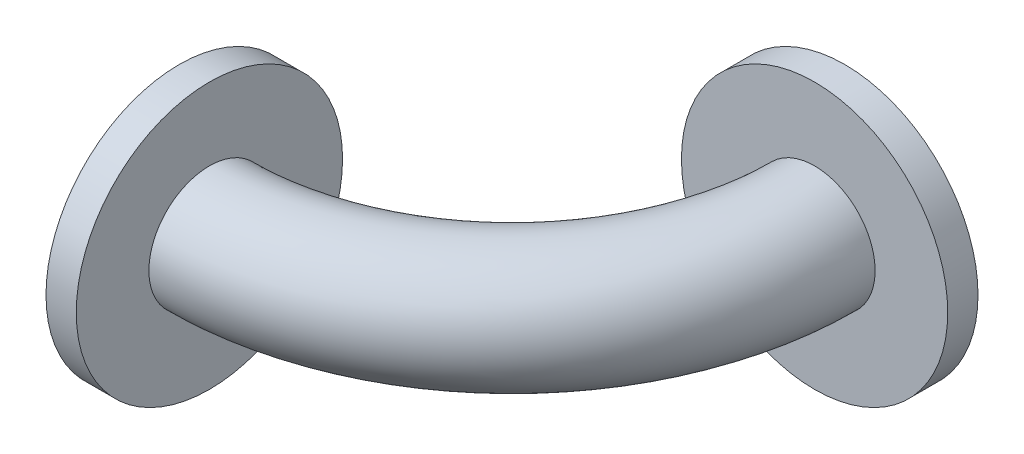
ISO-10303-21;
HEADER;
FILE_DESCRIPTION(('STEP AP214'),'2;1');
FILE_NAME('part.step','',(''),(''),'','','');
FILE_SCHEMA(('AUTOMOTIVE_DESIGN { 1 0 10303 214 1 1 1 1 }'));
ENDSEC;
DATA;
#1=APPLICATION_CONTEXT('core data for automotive mechanical design processes');
#2=APPLICATION_PROTOCOL_DEFINITION('international standard','automotive_design',2000,#1);
#3=PRODUCT_CONTEXT('',#1,'mechanical');
#4=PRODUCT('Part','Part','',(#3));
#5=PRODUCT_RELATED_PRODUCT_CATEGORY('part','',(#4));
#6=PRODUCT_DEFINITION_FORMATION('','',#4);
#7=PRODUCT_DEFINITION_CONTEXT('part definition',#1,'design');
#8=PRODUCT_DEFINITION('design','',#6,#7);
#9=PRODUCT_DEFINITION_SHAPE('','',#8);
#10=(LENGTH_UNIT() NAMED_UNIT(*) SI_UNIT(.MILLI.,.METRE.));
#11=(NAMED_UNIT(*) PLANE_ANGLE_UNIT() SI_UNIT($,.RADIAN.));
#12=(NAMED_UNIT(*) SI_UNIT($,.STERADIAN.) SOLID_ANGLE_UNIT());
#13=UNCERTAINTY_MEASURE_WITH_UNIT(LENGTH_MEASURE(1.E-05),#10,'distance_accuracy_value','');
#14=(GEOMETRIC_REPRESENTATION_CONTEXT(3) GLOBAL_UNCERTAINTY_ASSIGNED_CONTEXT((#13)) GLOBAL_UNIT_ASSIGNED_CONTEXT((#10,
#11,#12)) REPRESENTATION_CONTEXT('',''));
#15=CARTESIAN_POINT('',(0.,0.,0.));
#16=DIRECTION('',(0.,0.,1.));
#17=DIRECTION('',(1.,0.,0.));
#18=AXIS2_PLACEMENT_3D('',#15,#16,#17);
#19=CARTESIAN_POINT('',(50.,0.,0.));
#20=DIRECTION('',(-2.66713917932478E-06,0.,0.999999999996443));
#21=DIRECTION('',(0.999999999996443,0.,2.66713917932478E-06));
#22=AXIS2_PLACEMENT_3D('',#19,#20,#21);
#23=PLANE('',#22);
#24=CARTESIAN_POINT('',(50.,0.,0.));
#25=DIRECTION('',(-2.66713917932478E-06,0.,0.999999999996443));
#26=DIRECTION('',(0.999999999996443,0.,2.66713917932478E-06));
#27=AXIS2_PLACEMENT_3D('',#24,#25,#26);
#28=CIRCLE('',#27,10.);
#29=CARTESIAN_POINT('',(49.9999999993303,-10.,0.));
#30=VERTEX_POINT('',#29);
#31=CARTESIAN_POINT('',(49.9999999993303,10.,0.));
#32=VERTEX_POINT('',#31);
#33=EDGE_CURVE('E93',#30,#32,#28,.T.);
#34=ORIENTED_EDGE('',*,*,#33,.F.);
#35=DIRECTION('',(0.,1.,0.));
#36=VECTOR('',#35,1.);
#37=CARTESIAN_POINT('',(49.9999999993303,0.,0.));
#38=LINE('',#37,#36);
#39=EDGE_CURVE('E123',#30,#32,#38,.T.);
#40=ORIENTED_EDGE('',*,*,#39,.T.);
#41=EDGE_LOOP('',(#34,#40));
#42=FACE_BOUND('',#41,.T.);
#43=ADVANCED_FACE('F57',(#42),#23,.F.);
#44=CARTESIAN_POINT('',(0.,0.,50.));
#45=DIRECTION('',(-0.999999999996443,0.,2.66713917931204E-06));
#46=DIRECTION('',(2.66713917931204E-06,0.,0.999999999996443));
#47=AXIS2_PLACEMENT_3D('',#44,#45,#46);
#48=PLANE('',#47);
#49=DIRECTION('',(0.,1.,0.));
#50=VECTOR('',#49,1.);
#51=CARTESIAN_POINT('',(0.,0.,50.0000000010898));
#52=LINE('',#51,#50);
#53=CARTESIAN_POINT('',(0.,-10.,50.0000000010898));
#54=VERTEX_POINT('',#53);
#55=CARTESIAN_POINT('',(0.,10.,50.0000000010898));
#56=VERTEX_POINT('',#55);
#57=EDGE_CURVE('E95',#54,#56,#52,.T.);
#58=ORIENTED_EDGE('',*,*,#57,.F.);
#59=CARTESIAN_POINT('',(0.,0.,50.));
#60=DIRECTION('',(-0.999999999996443,0.,2.66713917931204E-06));
#61=DIRECTION('',(2.66713917931204E-06,0.,0.999999999996443));
#62=AXIS2_PLACEMENT_3D('',#59,#60,#61);
#63=CIRCLE('',#62,10.);
#64=EDGE_CURVE('E87',#54,#56,#63,.T.);
#65=ORIENTED_EDGE('',*,*,#64,.T.);
#66=EDGE_LOOP('',(#58,#65));
#67=FACE_BOUND('',#66,.T.);
#68=ADVANCED_FACE('F96',(#67),#48,.T.);
#69=CARTESIAN_POINT('',(-0.000133357314656413,0.,-0.000133357314642535));
#70=DIRECTION('',(0.,-1.,0.));
#71=DIRECTION('',(0.,0.,-1.));
#72=AXIS2_PLACEMENT_3D('',#69,#70,#71);
#73=TOROIDAL_SURFACE('',#72,50.0001333574925,10.);
#74=CARTESIAN_POINT('',(0.,-6.20998558255818,42.1618829388087));
#75=CARTESIAN_POINT('',(0.,-6.43020132472098,42.3363529568234));
#76=CARTESIAN_POINT('',(0.,-6.64303285438604,42.5200899047318));
#77=CARTESIAN_POINT('',(0.,-7.05254164509043,42.9048890274845));
#78=CARTESIAN_POINT('',(0.,-7.24921464100729,43.1059557480911));
#79=CARTESIAN_POINT('',(0.,-7.62512838650704,43.5241557106135));
#80=CARTESIAN_POINT('',(0.,-7.80435032983617,43.7413058509477));
#81=CARTESIAN_POINT('',(0.,-8.14385630952761,44.1899450428166));
#82=CARTESIAN_POINT('',(0.,-8.30414001069893,44.421434348032));
#83=CARTESIAN_POINT('',(0.,-8.6045491768707,44.8969819689388));
#84=CARTESIAN_POINT('',(0.,-8.74468457834601,45.1410340078995));
#85=CARTESIAN_POINT('',(0.,-9.00389737381209,45.640081098134));
#86=CARTESIAN_POINT('',(0.,-9.12297443523223,45.8950763221526));
#87=CARTESIAN_POINT('',(0.,-9.33919428057714,46.414128770026));
#88=CARTESIAN_POINT('',(0.,-9.43634245654888,46.6781837477608));
#89=CARTESIAN_POINT('',(0.,-9.6080496633999,47.2135326322725));
#90=CARTESIAN_POINT('',(0.,-9.68260917632374,47.4848263844387));
#91=CARTESIAN_POINT('',(0.,-9.80861915595535,48.0327615305167));
#92=CARTESIAN_POINT('',(0.,-9.86006696428687,48.3094035357852));
#93=CARTESIAN_POINT('',(0.,-9.93947525654056,48.8660384730009));
#94=CARTESIAN_POINT('',(0.,-9.96743571666048,49.1460314083438));
#95=CARTESIAN_POINT('',(0.,-9.99967107927889,49.7073883721859));
#96=CARTESIAN_POINT('',(0.,-10.0039450598039,49.9887524536291));
#97=CARTESIAN_POINT('',(0.,-9.98877460360229,50.5508404118287));
#98=CARTESIAN_POINT('',(0.,-9.96933017151927,50.8315642887104));
#99=CARTESIAN_POINT('',(0.,-9.90686172377564,51.390370845688));
#100=CARTESIAN_POINT('',(0.,-9.86383814598608,51.6684535747331));
#101=CARTESIAN_POINT('',(0.,-9.7545175736548,52.2200061277375));
#102=CARTESIAN_POINT('',(0.,-9.6882205786841,52.4934759516117));
#103=CARTESIAN_POINT('',(0.,-9.53282466253206,53.0338579296848));
#104=CARTESIAN_POINT('',(0.,-9.44372578748154,53.3007700971495));
#105=CARTESIAN_POINT('',(0.,-9.24335948463269,53.8261397544671));
#106=CARTESIAN_POINT('',(0.,-9.13209205685992,54.0845972443297));
#107=CARTESIAN_POINT('',(0.,-8.88817945836035,54.5912205567905));
#108=CARTESIAN_POINT('',(0.,-8.75553424679093,54.8393863597252));
#109=CARTESIAN_POINT('',(0.,-8.46980926185577,55.3236614611694));
#110=CARTESIAN_POINT('',(0.,-8.31672948849588,55.5597707596825));
#111=CARTESIAN_POINT('',(0.,-7.9912239814256,56.0182538396924));
#112=CARTESIAN_POINT('',(0.,-7.8187982826241,56.2406276459733));
#113=CARTESIAN_POINT('',(0.,-7.4558265419549,56.6700592633049));
#114=CARTESIAN_POINT('',(0.,-7.26528050010919,56.8771170743742));
#115=CARTESIAN_POINT('',(0.,-6.86742266452255,57.2744447214721));
#116=CARTESIAN_POINT('',(0.,-6.66011086451516,57.4647145512258));
#117=CARTESIAN_POINT('',(0.,-6.23019543542138,57.8271134459517));
#118=CARTESIAN_POINT('',(0.,-6.00759180631476,57.9992425108999));
#119=CARTESIAN_POINT('',(0.,-5.54867505323398,58.3241363143472));
#120=CARTESIAN_POINT('',(0.,-5.31236191477447,58.4769010323857));
#121=CARTESIAN_POINT('',(0.,-4.82770640321088,58.7619798625098));
#122=CARTESIAN_POINT('',(0.,-4.57936403010063,58.894293974585));
#123=CARTESIAN_POINT('',(0.,-4.07241569934764,59.1375308780213));
#124=CARTESIAN_POINT('',(0.,-3.8138097450499,59.2484536763539));
#125=CARTESIAN_POINT('',(0.,-3.28817271021681,59.448119410904));
#126=CARTESIAN_POINT('',(0.,-3.02114162968762,59.5368623471377));
#127=CARTESIAN_POINT('',(0.,-2.48055288362745,59.6915374168667));
#128=CARTESIAN_POINT('',(0.,-2.2069952207403,59.7574695596023));
#129=CARTESIAN_POINT('',(0.,-1.65529803595878,59.8660543543523));
#130=CARTESIAN_POINT('',(0.,-1.37715851406495,59.9087070063696));
#131=CARTESIAN_POINT('',(0.,-0.818274977432024,59.9704295892364));
#132=CARTESIAN_POINT('',(0.,-0.537530962335549,59.98949951685));
#133=CARTESIAN_POINT('',(0.,0.024565601611151,60.003921064458));
#134=CARTESIAN_POINT('',(0.,0.305918150461528,59.9992726844465));
#135=CARTESIAN_POINT('',(0.,0.867231570815276,59.9662906618213));
#136=CARTESIAN_POINT('',(0.,1.14719244213664,59.93795701611));
#137=CARTESIAN_POINT('',(0.,1.70373211600869,59.8578058933131));
#138=CARTESIAN_POINT('',(0.,1.98031091855925,59.8059884162266));
#139=CARTESIAN_POINT('',(0.,2.5281201333005,59.6792380246667));
#140=CARTESIAN_POINT('',(0.,2.7993505457205,59.6043051111842));
#141=CARTESIAN_POINT('',(0.,3.33453470658328,59.4318565742432));
#142=CARTESIAN_POINT('',(0.,3.59848845502664,59.3343409507865));
#143=CARTESIAN_POINT('',(0.,4.11724272315744,59.1174202764797));
#144=CARTESIAN_POINT('',(0.,4.37204324325751,58.9980152266166));
#145=CARTESIAN_POINT('',(0.,4.87067958827505,58.7381645949056));
#146=CARTESIAN_POINT('',(0.,5.11451541319281,58.5977190130583));
#147=CARTESIAN_POINT('',(0.,5.58948884130497,58.2967858012721));
#148=CARTESIAN_POINT('',(0.,5.82062644449935,58.1362981713331));
#149=CARTESIAN_POINT('',(0.,6.26856017936834,57.7964218342045));
#150=CARTESIAN_POINT('',(0.,6.48535631104256,57.6170331270144));
#151=CARTESIAN_POINT('',(0.,6.903065821756,57.2406299730615));
#152=CARTESIAN_POINT('',(0.,7.10397920007923,57.0436155255041));
#153=CARTESIAN_POINT('',(0.,7.48849481943474,56.6333615524536));
#154=CARTESIAN_POINT('',(0.,7.67209706046568,56.4201220269593));
#155=CARTESIAN_POINT('',(0.,8.02068511071337,55.9789338939122));
#156=CARTESIAN_POINT('',(0.,8.18567091913195,55.7509852857288));
#157=CARTESIAN_POINT('',(0.,8.49585314467223,55.2819995737506));
#158=CARTESIAN_POINT('',(0.,8.64104956179463,55.0409624699564));
#159=CARTESIAN_POINT('',(0.,8.91062072743841,54.5475134286759));
#160=CARTESIAN_POINT('',(0.,9.0349954786828,54.2951014926772));
#161=CARTESIAN_POINT('',(0.,9.26203910579651,53.7806972551123));
#162=CARTESIAN_POINT('',(0.,9.36470798167127,53.5187049535485));
#163=CARTESIAN_POINT('',(0.,9.54760993141964,52.9870026293715));
#164=CARTESIAN_POINT('',(0.,9.62784300837192,52.7172926078174));
#165=CARTESIAN_POINT('',(0.,9.76530297013513,52.1720722851394));
#166=CARTESIAN_POINT('',(0.,9.8225298549434,51.896561984015));
#167=CARTESIAN_POINT('',(0.,9.91357060214882,51.3416997020809));
#168=CARTESIAN_POINT('',(0.,9.94738445506185,51.0623477197152));
#169=CARTESIAN_POINT('',(0.,9.99135870471777,50.501788210554));
#170=CARTESIAN_POINT('',(0.,10.0015191014434,50.2205806837573));
#171=CARTESIAN_POINT('',(0.,9.99811420376144,49.6583092120281));
#172=CARTESIAN_POINT('',(0.,9.98454890162156,49.3772452671425));
#173=CARTESIAN_POINT('',(0.,9.93378903254252,48.8172592494892));
#174=CARTESIAN_POINT('',(0.,9.89659446561549,48.5383371767204));
#175=CARTESIAN_POINT('',(0.,9.79884055009292,47.984618166952));
#176=CARTESIAN_POINT('',(0.,9.73828122618488,47.709821225594));
#177=CARTESIAN_POINT('',(0.,9.5942283345416,47.1663058169045));
#178=CARTESIAN_POINT('',(0.,9.5107347668367,46.897587349565));
#179=CARTESIAN_POINT('',(0.,9.32140701160263,46.3681394129501));
#180=CARTESIAN_POINT('',(0.,9.2155728324237,46.1074099406886));
#181=CARTESIAN_POINT('',(0.,8.98231625172075,45.5957935159635));
#182=CARTESIAN_POINT('',(0.,8.85489385017054,45.3449065635117));
#183=CARTESIAN_POINT('',(0.,8.5793664711872,44.854758388752));
#184=CARTESIAN_POINT('',(0.,8.4312614564342,44.6154971874226));
#185=CARTESIAN_POINT('',(0.,8.11542196491531,44.1503020063497));
#186=CARTESIAN_POINT('',(0.,7.94768748814381,43.92436802661));
#187=CARTESIAN_POINT('',(0.,7.59378190483604,43.4874339646057));
#188=CARTESIAN_POINT('',(0.,7.40761083352429,43.2764338538102));
#189=CARTESIAN_POINT('',(0.,7.01815535528078,42.8708671359784));
#190=CARTESIAN_POINT('',(0.,6.81487094832929,42.6763005289612));
#191=CARTESIAN_POINT('',(0.,6.39263359844399,42.3049836920898));
#192=CARTESIAN_POINT('',(0.,6.17368062381195,42.1282334982807));
#193=CARTESIAN_POINT('',(0.,5.72166313589121,41.7938065303585));
#194=CARTESIAN_POINT('',(0.,5.48859862286261,41.6361297558938));
#195=CARTESIAN_POINT('',(0.,5.01001055813585,41.3409678691536));
#196=CARTESIAN_POINT('',(0.,4.76448677515396,41.2034831318913));
#197=CARTESIAN_POINT('',(0.,4.26272969886802,40.9496862605778));
#198=CARTESIAN_POINT('',(0.,4.00649640346725,40.833374130672));
#199=CARTESIAN_POINT('',(0.,3.48515224531628,40.6227535518669));
#200=CARTESIAN_POINT('',(0.,3.22004172848917,40.528444246711));
#201=CARTESIAN_POINT('',(0.,2.68281862890009,40.3624940388988));
#202=CARTESIAN_POINT('',(0.,2.41070605323433,40.2908531132704));
#203=CARTESIAN_POINT('',(0.,1.86144467386462,40.1707557510868));
#204=CARTESIAN_POINT('',(0.,1.58429645282508,40.1222966497196));
#205=CARTESIAN_POINT('',(0.,1.02689723226402,40.048894320425));
#206=CARTESIAN_POINT('',(0.,0.74664616664901,40.023951594397));
#207=CARTESIAN_POINT('',(0.,0.184969787160073,39.9977578950793));
#208=CARTESIAN_POINT('',(0.,-0.0964557988441161,39.9965127566134));
#209=CARTESIAN_POINT('',(0.,-0.658406660668894,40.0177377535432));
#210=CARTESIAN_POINT('',(0.,-0.938931950636251,40.0402075144474));
#211=CARTESIAN_POINT('',(0.,-1.49723058144236,40.1087191609368));
#212=CARTESIAN_POINT('',(0.,-1.77500249097888,40.1547727119518));
#213=CARTESIAN_POINT('',(0.,-2.32566976303352,40.2701286403147));
#214=CARTESIAN_POINT('',(0.,-2.598565211761,40.3394306062324));
#215=CARTESIAN_POINT('',(0.,-3.13726004570646,40.5007074755703));
#216=CARTESIAN_POINT('',(0.,-3.40306667782265,40.5926581568067));
#217=CARTESIAN_POINT('',(0.,-3.92590982917891,40.7985776886846));
#218=CARTESIAN_POINT('',(0.,-4.18294863694591,40.9125407412342));
#219=CARTESIAN_POINT('',(0.,-4.74924099581045,41.1927433730867));
#220=CARTESIAN_POINT('',(0.,-5.05557035306543,41.364934631929));
#221=CARTESIAN_POINT('',(0.,-5.64843390139968,41.7405605536991));
#222=CARTESIAN_POINT('',(0.,-5.93496809247894,41.9439952166268));
#223=CARTESIAN_POINT('',(0.,-6.20998558255818,42.1618829388087));
#224=B_SPLINE_CURVE_WITH_KNOTS('',3,(#74,#75,#76,#77,#78,#79,#80,#81,#82,#83,#84,#85,#86,#87,
#88,#89,#90,#91,#92,#93,#94,#95,#96,#97,#98,#99,#100,#101,#102,#103,#104,#105,#106,#107,#108,
#109,#110,#111,#112,#113,#114,#115,#116,#117,#118,#119,#120,#121,#122,#123,#124,#125,#126,#127,
#128,#129,#130,#131,#132,#133,#134,#135,#136,#137,#138,#139,#140,#141,#142,#143,#144,#145,#146,
#147,#148,#149,#150,#151,#152,#153,#154,#155,#156,#157,#158,#159,#160,#161,#162,#163,#164,#165,
#166,#167,#168,#169,#170,#171,#172,#173,#174,#175,#176,#177,#178,#179,#180,#181,#182,#183,#184,
#185,#186,#187,#188,#189,#190,#191,#192,#193,#194,#195,#196,#197,#198,#199,#200,#201,#202,#203,
#204,#205,#206,#207,#208,#209,#210,#211,#212,#213,#214,#215,#216,#217,#218,#219,#220,#221,#222,
#223),.UNSPECIFIED.,.T.,.F.,(4,2,2,2,2,2,2,2,2,2,2,2,2,2,2,2,2,2,2,2,2,2,2,2,2,2,2,2,2,2,2,2,2,
2,2,2,2,2,2,2,2,2,2,2,2,2,2,2,2,2,2,2,2,2,2,2,2,2,2,2,2,2,2,2,2,2,2,2,2,2,2,2,2,2,4),(0.,
0.842553434720956,1.68532855570639,2.52900207443473,3.37269052324004,4.2159614550393,
5.05924570327715,5.90232237172226,6.7453810475503,7.58853666965376,8.43169314621697,
9.27488244160591,10.1180715719138,10.9612450445041,11.8044185326358,12.6475903149437,
13.4907620962797,14.333935488529,15.177108880537,16.0202807510996,16.8634526206392,
17.7066248053293,18.5497969911353,19.3929700678461,20.2361431449891,21.0793159473369,
21.922488749068,22.765661209248,23.6088336693299,24.4520062451135,25.2951788211084,
26.1383515073718,26.9815241936647,27.8246968438083,28.667869493886,29.5110421059532,
30.3542147179978,31.1973873300431,32.040559942111,32.8837325921895,33.7269052423338,
34.5700779286288,35.4132506148942,36.2564231908913,37.0995957666769,37.9427682267618,
38.7859406869447,39.6291134886788,40.4722862910295,41.3154593681755,42.1586324448892,
43.0018046306982,43.8449768153913,44.6881486849326,45.531320555497,46.3744939475067,
47.2176673397578,48.0608391210929,48.9040109034001,49.7471843915309,50.5903578641204,
51.4335469944245,52.2767362898096,53.119892766369,53.9630483884687,54.8061070642906,
55.6491837327297,56.4924679809614,57.3357389127546,58.1794273615513,59.023100880271,
59.8658760012479,60.7084294359603,61.7606563503436,62.8128832647268),.UNSPECIFIED.);
#225=EDGE_CURVE('E12',#56,#54,#224,.T.);
#226=ORIENTED_EDGE('',*,*,#225,.F.);
#227=ORIENTED_EDGE('',*,*,#64,.F.);
#228=EDGE_LOOP('',(#226,#227));
#229=FACE_BOUND('',#228,.T.);
#230=CARTESIAN_POINT('',(41.9999999999675,-6.00000000000176,0.));
#231=CARTESIAN_POINT('',(41.8314264035113,-5.77523856456629,0.));
#232=CARTESIAN_POINT('',(41.6723519470669,-5.54339412673767,0.));
#233=CARTESIAN_POINT('',(41.374234007088,-5.067060726278,0.));
#234=CARTESIAN_POINT('',(41.2351958049634,-4.82256845276572,0.));
#235=CARTESIAN_POINT('',(40.9780660098721,-4.32248183908658,0.));
#236=CARTESIAN_POINT('',(40.8599969039742,-4.06687594195366,0.));
#237=CARTESIAN_POINT('',(40.6458218136703,-3.54661594405293,0.));
#238=CARTESIAN_POINT('',(40.5497162179719,-3.28196168324354,0.));
#239=CARTESIAN_POINT('',(40.3801979595513,-2.74562711701867,0.));
#240=CARTESIAN_POINT('',(40.3067740902889,-2.47395035340253,0.));
#241=CARTESIAN_POINT('',(40.1830757052579,-1.92537220843036,0.));
#242=CARTESIAN_POINT('',(40.1328015550686,-1.64847074463799,0.));
#243=CARTESIAN_POINT('',(40.0557714124722,-1.09148526700735,0.));
#244=CARTESIAN_POINT('',(40.0290096339671,-0.811402053352338,0.));
#245=CARTESIAN_POINT('',(39.9991736671565,-0.24998277321268,0.));
#246=CARTESIAN_POINT('',(39.9960989733318,0.0313532664065012,0.));
#247=CARTESIAN_POINT('',(40.0136587264254,0.593316872291762,0.));
#248=CARTESIAN_POINT('',(40.0342958997814,0.87394435336776,0.));
#249=CARTESIAN_POINT('',(40.099137150124,1.43246359426671,0.));
#250=CARTESIAN_POINT('',(40.1433412509933,1.71035535131697,0.));
#251=CARTESIAN_POINT('',(40.255004295806,2.26143803465299,0.));
#252=CARTESIAN_POINT('',(40.3224641448483,2.53462877754369,0.));
#253=CARTESIAN_POINT('',(40.4801586888924,3.07435597369518,0.));
#254=CARTESIAN_POINT('',(40.5703933794352,3.34089242825874,0.));
#255=CARTESIAN_POINT('',(40.7729941894959,3.86541124283057,0.));
#256=CARTESIAN_POINT('',(40.88535989801,4.12339376159338,0.));
#257=CARTESIAN_POINT('',(41.1314249527721,4.62897579754572,0.));
#258=CARTESIAN_POINT('',(41.2651242994134,4.87657531454388,0.));
#259=CARTESIAN_POINT('',(41.5529058127922,5.35963056348833,0.));
#260=CARTESIAN_POINT('',(41.7069879382927,5.59508632000169,0.));
#261=CARTESIAN_POINT('',(42.034439788758,6.05218064042862,0.));
#262=CARTESIAN_POINT('',(42.2078095137005,6.27381920435812,0.));
#263=CARTESIAN_POINT('',(42.5726043596335,6.70170383461561,0.));
#264=CARTESIAN_POINT('',(42.764029515119,6.90794987153473,0.));
#265=CARTESIAN_POINT('',(43.1635740217453,7.30358269135118,0.));
#266=CARTESIAN_POINT('',(43.3716933728813,7.49296947425334,0.));
#267=CARTESIAN_POINT('',(43.8031462745918,7.85353703157115,0.));
#268=CARTESIAN_POINT('',(44.0264797977128,8.02471783883762,0.));
#269=CARTESIAN_POINT('',(44.4867736131906,8.34765684533502,0.));
#270=CARTESIAN_POINT('',(44.7237339055308,8.49941504458952,0.));
#271=CARTESIAN_POINT('',(45.2095967078661,8.78242998022274,0.));
#272=CARTESIAN_POINT('',(45.4584992223248,8.91368670893849,0.));
#273=CARTESIAN_POINT('',(45.9664768413055,9.15476547964868,0.));
#274=CARTESIAN_POINT('',(46.225551945841,9.26458752161474,0.));
#275=CARTESIAN_POINT('',(46.7520331563694,9.46201625492945,0.));
#276=CARTESIAN_POINT('',(47.0194392711647,9.549622922805,0.));
#277=CARTESIAN_POINT('',(47.5606811422236,9.70199792497949,0.));
#278=CARTESIAN_POINT('',(47.8345168984903,9.76676625926672,0.));
#279=CARTESIAN_POINT('',(48.3866711521309,9.8730041123883,0.));
#280=CARTESIAN_POINT('',(48.6649896480438,9.91447363881574,0.));
#281=CARTESIAN_POINT('',(49.2241307893944,9.97381908510582,0.));
#282=CARTESIAN_POINT('',(49.5049534348301,9.99169500498572,0.));
#283=CARTESIAN_POINT('',(50.0671062798365,10.0037261486732,0.));
#284=CARTESIAN_POINT('',(50.3484364792014,9.99788138208949,0.));
#285=CARTESIAN_POINT('',(50.9096044572702,9.96251272730055,0.));
#286=CARTESIAN_POINT('',(51.1894422359742,9.93298883909806,0.));
#287=CARTESIAN_POINT('',(51.7456359327891,9.85047183246567,0.));
#288=CARTESIAN_POINT('',(52.0219918504223,9.79747871081523,0.));
#289=CARTESIAN_POINT('',(52.5692570612562,9.66839998579528,0.));
#290=CARTESIAN_POINT('',(52.8401663544556,9.59231438241998,0.));
#291=CARTESIAN_POINT('',(53.3746123488409,9.41759160549357,0.));
#292=CARTESIAN_POINT('',(53.6381490490627,9.31895442899322,0.));
#293=CARTESIAN_POINT('',(54.155976232293,9.09982976266649,0.));
#294=CARTESIAN_POINT('',(54.4102667153011,8.97934227283934,0.));
#295=CARTESIAN_POINT('',(54.907793600213,8.71737357945955,0.));
#296=CARTESIAN_POINT('',(55.1510300025908,8.57589237680699,0.));
#297=CARTESIAN_POINT('',(55.6247194726852,8.27294210059335,0.));
#298=CARTESIAN_POINT('',(55.8551725404029,8.11147302703384,0.));
#299=CARTESIAN_POINT('',(56.3016569478077,7.76969496513573,0.));
#300=CARTESIAN_POINT('',(56.5176882881449,7.58938597764645,0.));
#301=CARTESIAN_POINT('',(56.9337933988347,7.21120997069252,0.));
#302=CARTESIAN_POINT('',(57.1338671691878,7.01334295122834,0.));
#303=CARTESIAN_POINT('',(57.5166347353415,6.60145759621685,0.));
#304=CARTESIAN_POINT('',(57.6993285311422,6.38743926066959,0.));
#305=CARTESIAN_POINT('',(58.0460373048253,5.94477281555865,0.));
#306=CARTESIAN_POINT('',(58.2100522827073,5.71612470599457,0.));
#307=CARTESIAN_POINT('',(58.5182373793296,5.24582425323225,0.));
#308=CARTESIAN_POINT('',(58.6624074971754,5.00417190944777,0.));
#309=CARTESIAN_POINT('',(58.9298779017829,4.50958100112702,0.));
#310=CARTESIAN_POINT('',(59.053178188543,4.25664243658987,0.));
#311=CARTESIAN_POINT('',(59.2780323445881,3.74127731744886,0.));
#312=CARTESIAN_POINT('',(59.3795862129409,3.47885076243823,0.));
#313=CARTESIAN_POINT('',(59.560225538224,2.94637536841382,0.));
#314=CARTESIAN_POINT('',(59.6393109951551,2.6763265294003,0.));
#315=CARTESIAN_POINT('',(59.7744512384693,2.13052648879602,0.));
#316=CARTESIAN_POINT('',(59.8305060278643,1.85477528795102,0.));
#317=CARTESIAN_POINT('',(59.9191864350554,1.2995309150687,0.));
#318=CARTESIAN_POINT('',(59.9518120528575,1.02003774303232,0.));
#319=CARTESIAN_POINT('',(59.9934021654622,0.459296494961077,0.));
#320=CARTESIAN_POINT('',(60.0023666635117,0.178048419167035,0.));
#321=CARTESIAN_POINT('',(59.9965708137919,-0.384203169956186,0.));
#322=CARTESIAN_POINT('',(59.9818104660199,-0.665206683285336,0.));
#323=CARTESIAN_POINT('',(59.9286698510423,-1.22497149514938,0.));
#324=CARTESIAN_POINT('',(59.8902895742689,-1.50373279277596,0.));
#325=CARTESIAN_POINT('',(59.7901819537701,-2.05703123146743,0.));
#326=CARTESIAN_POINT('',(59.7284546100276,-2.33156837252923,0.));
#327=CARTESIAN_POINT('',(59.5820916763239,-2.8744667910957,0.));
#328=CARTESIAN_POINT('',(59.4974560788968,-3.14282806658761,0.));
#329=CARTESIAN_POINT('',(59.3058783557833,-3.6714667714489,0.));
#330=CARTESIAN_POINT('',(59.1989362301084,-3.93174420082242,0.));
#331=CARTESIAN_POINT('',(58.9635058702899,-4.4423645249864,0.));
#332=CARTESIAN_POINT('',(58.8350176589123,-4.6927074302735,0.));
#333=CARTESIAN_POINT('',(58.5574085221204,-5.18167921088862,0.));
#334=CARTESIAN_POINT('',(58.4082875967333,-5.42030808623214,0.));
#335=CARTESIAN_POINT('',(58.0904732505884,-5.88415521392271,0.));
#336=CARTESIAN_POINT('',(57.9217798371462,-6.1093734712822,0.));
#337=CARTESIAN_POINT('',(57.5660197768935,-6.54479829603743,0.));
#338=CARTESIAN_POINT('',(57.3789531300606,-6.75500486341494,0.));
#339=CARTESIAN_POINT('',(56.987776179206,-7.15891223262756,0.));
#340=CARTESIAN_POINT('',(56.7836658444308,-7.35261300467846,0.));
#341=CARTESIAN_POINT('',(56.3598529141237,-7.72213125997208,0.));
#342=CARTESIAN_POINT('',(56.1401503185873,-7.89794874320969,0.));
#343=CARTESIAN_POINT('',(55.6867152570194,-8.23045014376663,0.));
#344=CARTESIAN_POINT('',(55.4529828177932,-8.3871340976407,0.));
#345=CARTESIAN_POINT('',(54.9731493830798,-8.68025490392073,0.));
#346=CARTESIAN_POINT('',(54.7270483875782,-8.81669175630336,0.));
#347=CARTESIAN_POINT('',(54.2242269580845,-9.06834863187171,0.));
#348=CARTESIAN_POINT('',(53.9675065026092,-9.18356861213304,0.));
#349=CARTESIAN_POINT('',(53.4452717580431,-9.3919722537143,0.));
#350=CARTESIAN_POINT('',(53.1797574691145,-9.48515591544041,0.));
#351=CARTESIAN_POINT('',(52.6418177040877,-9.64882596243885,0.));
#352=CARTESIAN_POINT('',(52.3693920997404,-9.71931192619093,0.));
#353=CARTESIAN_POINT('',(51.819571248691,-9.83708309092862,0.));
#354=CARTESIAN_POINT('',(51.5421760010161,-9.88436828737194,0.));
#355=CARTESIAN_POINT('',(50.9843989774114,-9.95540033220998,0.));
#356=CARTESIAN_POINT('',(50.7040173181444,-9.97914809669857,0.));
#357=CARTESIAN_POINT('',(50.1422503808102,-10.0029396566297,0.));
#358=CARTESIAN_POINT('',(49.8608651037604,-10.002983476094,0.));
#359=CARTESIAN_POINT('',(49.2991233832588,-9.97936825384785,0.));
#360=CARTESIAN_POINT('',(49.0187668252316,-9.95571193749857,0.));
#361=CARTESIAN_POINT('',(48.4610366753523,-9.8848679331709,0.));
#362=CARTESIAN_POINT('',(48.1836631472906,-9.8376797429951,0.));
#363=CARTESIAN_POINT('',(47.6338088641995,-9.72009261558878,0.));
#364=CARTESIAN_POINT('',(47.361329330669,-9.64968796633886,0.));
#365=CARTESIAN_POINT('',(46.8232752977523,-9.48617304571087,0.));
#366=CARTESIAN_POINT('',(46.5577006893955,-9.39306313289854,0.));
#367=CARTESIAN_POINT('',(46.0352107763439,-9.18474727265052,0.));
#368=CARTESIAN_POINT('',(45.7782998241126,-9.06953040793752,0.));
#369=CARTESIAN_POINT('',(45.2751096285732,-8.81785390557428,0.));
#370=CARTESIAN_POINT('',(45.0288301972049,-8.68139464387641,0.));
#371=CARTESIAN_POINT('',(44.5489029713836,-8.38835503797543,0.));
#372=CARTESIAN_POINT('',(44.3152420052176,-8.23179627472917,0.));
#373=CARTESIAN_POINT('',(43.8620040533968,-7.89961684495312,0.));
#374=CARTESIAN_POINT('',(43.642423379214,-7.72400120335994,0.));
#375=CARTESIAN_POINT('',(43.1660676645997,-7.30892797635115,0.));
#376=CARTESIAN_POINT('',(42.913634976943,-7.06445866754354,0.));
#377=CARTESIAN_POINT('',(42.4358631184931,-6.55034187988129,0.));
#378=CARTESIAN_POINT('',(42.2105239476999,-6.28069440102664,0.));
#379=CARTESIAN_POINT('',(41.9999999999675,-6.00000000000176,0.));
#380=B_SPLINE_CURVE_WITH_KNOTS('',3,(#230,#231,#232,#233,#234,#235,#236,#237,#238,#239,#240,
#241,#242,#243,#244,#245,#246,#247,#248,#249,#250,#251,#252,#253,#254,#255,#256,#257,#258,#259,
#260,#261,#262,#263,#264,#265,#266,#267,#268,#269,#270,#271,#272,#273,#274,#275,#276,#277,#278,
#279,#280,#281,#282,#283,#284,#285,#286,#287,#288,#289,#290,#291,#292,#293,#294,#295,#296,#297,
#298,#299,#300,#301,#302,#303,#304,#305,#306,#307,#308,#309,#310,#311,#312,#313,#314,#315,#316,
#317,#318,#319,#320,#321,#322,#323,#324,#325,#326,#327,#328,#329,#330,#331,#332,#333,#334,#335,
#336,#337,#338,#339,#340,#341,#342,#343,#344,#345,#346,#347,#348,#349,#350,#351,#352,#353,#354,
#355,#356,#357,#358,#359,#360,#361,#362,#363,#364,#365,#366,#367,#368,#369,#370,#371,#372,#373,
#374,#375,#376,#377,#378,#379),.UNSPECIFIED.,.T.,.F.,(4,2,2,2,2,2,2,2,2,2,2,2,2,2,2,2,2,2,2,2,2,
2,2,2,2,2,2,2,2,2,2,2,2,2,2,2,2,2,2,2,2,2,2,2,2,2,2,2,2,2,2,2,2,2,2,2,2,2,2,2,2,2,2,2,2,2,2,2,2,
2,2,2,2,2,4),(0.,0.842553434714818,1.68532855569408,2.52900207441617,3.37269052321523,
4.21596145500851,5.0592457032404,5.90232237167955,6.74538104750164,7.58853666959507,
8.43169314614823,9.27488244152712,10.1180715718249,10.9612450444051,11.8044185325266,
12.6475903148244,13.4907620961502,14.3339354883943,15.1771088803972,16.0202807509547,
16.8634526204891,17.7066248051805,18.5497969909879,19.3929700677,20.2361431448444,
21.0793159471983,21.9224887489356,22.7656612091216,23.6088336692097,24.4520062450009,
25.2951788210036,26.1383515072746,26.9815241935752,27.8246968437251,28.6678694938093,
29.5110421058828,30.3542147179338,31.1973873299823,32.0405599420534,32.8837325921351,
33.7269052422826,34.5700779285768,35.4132506148415,36.2564231908378,37.0995957666226,
37.9427682267029,38.7859406868813,39.6291134886108,40.472286290957,41.3154593680959,
42.1586324448024,43.0018046306043,43.8449768152902,44.688148684824,45.5313205553809,
46.3744939473832,47.2176673396268,48.0608391209573,48.9040109032597,49.747184391386,
50.5903578639708,51.4335469942759,52.2767362896621,53.1198927662226,53.9630483883233,
54.8061070641527,55.6491837325992,56.4924679808385,57.3357389126391,58.1794273614466,
59.0231008801772,59.8658760011649,60.7084294358882,61.7606563503075,62.8128832647268),.UNSPECIFIED.);
#381=EDGE_CURVE('E72',#30,#32,#380,.T.);
#382=ORIENTED_EDGE('',*,*,#381,.F.);
#383=ORIENTED_EDGE('',*,*,#33,.T.);
#384=EDGE_LOOP('',(#382,#383));
#385=FACE_BOUND('',#384,.T.);
#386=ADVANCED_FACE('F89',(#229,#385),#73,.T.);
#387=CARTESIAN_POINT('',(50.,0.,0.));
#388=DIRECTION('',(0.,0.,1.));
#389=DIRECTION('',(1.,0.,0.));
#390=AXIS2_PLACEMENT_3D('',#387,#388,#389);
#391=PLANE('',#390);
#392=CARTESIAN_POINT('',(50.,0.,0.));
#393=DIRECTION('',(0.,0.,1.));
#394=DIRECTION('',(1.,0.,0.));
#395=AXIS2_PLACEMENT_3D('',#392,#393,#394);
#396=CIRCLE('',#395,22.);
#397=CARTESIAN_POINT('',(72.,0.,0.));
#398=VERTEX_POINT('',#397);
#399=EDGE_CURVE('E99',#398,#398,#396,.T.);
#400=ORIENTED_EDGE('',*,*,#399,.T.);
#401=EDGE_LOOP('',(#400));
#402=FACE_BOUND('',#401,.T.);
#403=ORIENTED_EDGE('',*,*,#39,.F.);
#404=ORIENTED_EDGE('',*,*,#381,.T.);
#405=EDGE_LOOP('',(#403,#404));
#406=FACE_BOUND('',#405,.T.);
#407=ADVANCED_FACE('F148',(#402,#406),#391,.T.);
#408=CARTESIAN_POINT('',(50.,0.,-5.));
#409=DIRECTION('',(0.,0.,1.));
#410=DIRECTION('',(1.,0.,0.));
#411=AXIS2_PLACEMENT_3D('',#408,#409,#410);
#412=CYLINDRICAL_SURFACE('',#411,22.);
#413=CARTESIAN_POINT('',(50.,0.,-5.));
#414=DIRECTION('',(0.,0.,1.));
#415=DIRECTION('',(1.,0.,0.));
#416=AXIS2_PLACEMENT_3D('',#413,#414,#415);
#417=CIRCLE('',#416,22.);
#418=CARTESIAN_POINT('',(72.,0.,-5.));
#419=VERTEX_POINT('',#418);
#420=EDGE_CURVE('E119',#419,#419,#417,.T.);
#421=ORIENTED_EDGE('',*,*,#420,.T.);
#422=EDGE_LOOP('',(#421));
#423=FACE_BOUND('',#422,.T.);
#424=ORIENTED_EDGE('',*,*,#399,.F.);
#425=EDGE_LOOP('',(#424));
#426=FACE_BOUND('',#425,.T.);
#427=ADVANCED_FACE('F153',(#423,#426),#412,.T.);
#428=CARTESIAN_POINT('',(50.,0.,-5.));
#429=DIRECTION('',(0.,0.,1.));
#430=DIRECTION('',(1.,0.,0.));
#431=AXIS2_PLACEMENT_3D('',#428,#429,#430);
#432=PLANE('',#431);
#433=ORIENTED_EDGE('',*,*,#420,.F.);
#434=EDGE_LOOP('',(#433));
#435=FACE_BOUND('',#434,.T.);
#436=ADVANCED_FACE('F156',(#435),#432,.F.);
#437=CARTESIAN_POINT('',(-5.,0.,50.));
#438=DIRECTION('',(1.,0.,0.));
#439=DIRECTION('',(0.,0.,-1.));
#440=AXIS2_PLACEMENT_3D('',#437,#438,#439);
#441=CYLINDRICAL_SURFACE('',#440,22.);
#442=CARTESIAN_POINT('',(-5.,0.,50.));
#443=DIRECTION('',(1.,0.,0.));
#444=DIRECTION('',(0.,0.,-1.));
#445=AXIS2_PLACEMENT_3D('',#442,#443,#444);
#446=CIRCLE('',#445,22.);
#447=CARTESIAN_POINT('',(-5.,0.,28.));
#448=VERTEX_POINT('',#447);
#449=EDGE_CURVE('E100',#448,#448,#446,.T.);
#450=ORIENTED_EDGE('',*,*,#449,.T.);
#451=EDGE_LOOP('',(#450));
#452=FACE_BOUND('',#451,.T.);
#453=CARTESIAN_POINT('',(0.,0.,50.));
#454=DIRECTION('',(1.,0.,0.));
#455=DIRECTION('',(0.,0.,-1.));
#456=AXIS2_PLACEMENT_3D('',#453,#454,#455);
#457=CIRCLE('',#456,22.);
#458=CARTESIAN_POINT('',(0.,0.,28.));
#459=VERTEX_POINT('',#458);
#460=EDGE_CURVE('E108',#459,#459,#457,.T.);
#461=ORIENTED_EDGE('',*,*,#460,.F.);
#462=EDGE_LOOP('',(#461));
#463=FACE_BOUND('',#462,.T.);
#464=ADVANCED_FACE('F162',(#452,#463),#441,.T.);
#465=CARTESIAN_POINT('',(-5.,0.,50.));
#466=DIRECTION('',(1.,0.,0.));
#467=DIRECTION('',(0.,0.,-1.));
#468=AXIS2_PLACEMENT_3D('',#465,#466,#467);
#469=PLANE('',#468);
#470=ORIENTED_EDGE('',*,*,#449,.F.);
#471=EDGE_LOOP('',(#470));
#472=FACE_BOUND('',#471,.T.);
#473=ADVANCED_FACE('F105',(#472),#469,.F.);
#474=CARTESIAN_POINT('',(0.,0.,50.));
#475=DIRECTION('',(1.,0.,0.));
#476=DIRECTION('',(0.,0.,-1.));
#477=AXIS2_PLACEMENT_3D('',#474,#475,#476);
#478=PLANE('',#477);
#479=ORIENTED_EDGE('',*,*,#225,.T.);
#480=ORIENTED_EDGE('',*,*,#57,.T.);
#481=EDGE_LOOP('',(#479,#480));
#482=FACE_BOUND('',#481,.T.);
#483=ORIENTED_EDGE('',*,*,#460,.T.);
#484=EDGE_LOOP('',(#483));
#485=FACE_BOUND('',#484,.T.);
#486=ADVANCED_FACE('F102',(#482,#485),#478,.T.);
#487=CLOSED_SHELL('',(#43,#68,#386,#407,#427,#436,#464,#473,#486));
#488=MANIFOLD_SOLID_BREP('B2',#487);
#489=ADVANCED_BREP_SHAPE_REPRESENTATION('',(#18,#488),#14);
#490=SHAPE_DEFINITION_REPRESENTATION(#9,#489);
ENDSEC;
END-ISO-10303-21;
